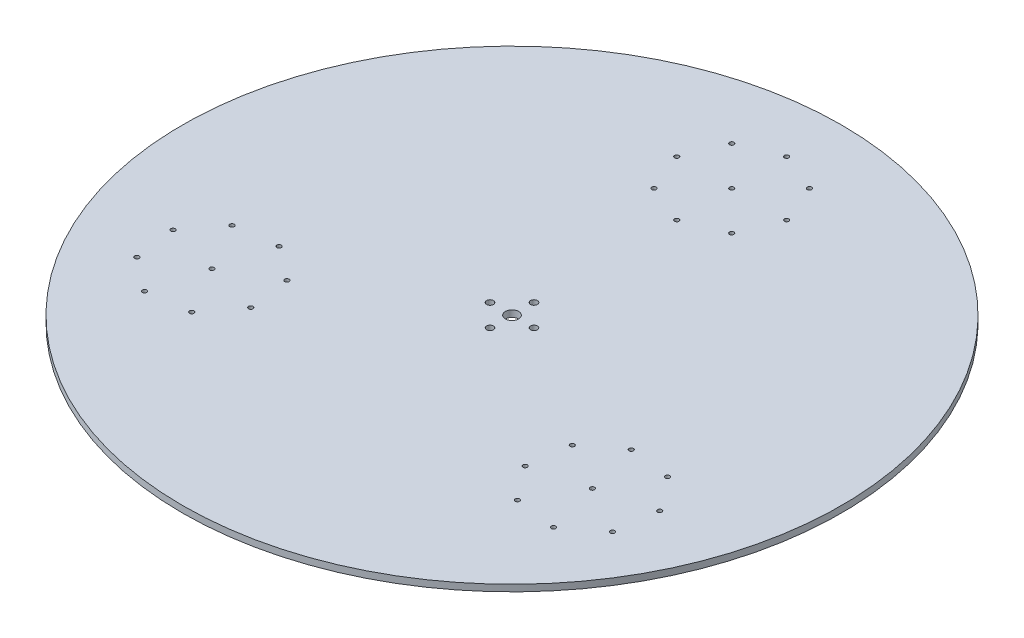
ISO-10303-21;
HEADER;
FILE_DESCRIPTION(('STEP AP214'),'2;1');
FILE_NAME('part.step','',(''),(''),'','','');
FILE_SCHEMA(('AUTOMOTIVE_DESIGN { 1 0 10303 214 1 1 1 1 }'));
ENDSEC;
DATA;
#1=APPLICATION_CONTEXT('core data for automotive mechanical design processes');
#2=APPLICATION_PROTOCOL_DEFINITION('international standard','automotive_design',2000,#1);
#3=PRODUCT_CONTEXT('',#1,'mechanical');
#4=PRODUCT('Part','Part','',(#3));
#5=PRODUCT_RELATED_PRODUCT_CATEGORY('part','',(#4));
#6=PRODUCT_DEFINITION_FORMATION('','',#4);
#7=PRODUCT_DEFINITION_CONTEXT('part definition',#1,'design');
#8=PRODUCT_DEFINITION('design','',#6,#7);
#9=PRODUCT_DEFINITION_SHAPE('','',#8);
#10=(LENGTH_UNIT() NAMED_UNIT(*) SI_UNIT(.MILLI.,.METRE.));
#11=(NAMED_UNIT(*) PLANE_ANGLE_UNIT() SI_UNIT($,.RADIAN.));
#12=(NAMED_UNIT(*) SI_UNIT($,.STERADIAN.) SOLID_ANGLE_UNIT());
#13=UNCERTAINTY_MEASURE_WITH_UNIT(LENGTH_MEASURE(1.E-05),#10,'distance_accuracy_value','');
#14=(GEOMETRIC_REPRESENTATION_CONTEXT(3) GLOBAL_UNCERTAINTY_ASSIGNED_CONTEXT((#13)) GLOBAL_UNIT_ASSIGNED_CONTEXT((#10,
#11,#12)) REPRESENTATION_CONTEXT('',''));
#15=CARTESIAN_POINT('',(0.,0.,0.));
#16=DIRECTION('',(0.,0.,1.));
#17=DIRECTION('',(1.,0.,0.));
#18=AXIS2_PLACEMENT_3D('',#15,#16,#17);
#19=CARTESIAN_POINT('',(0.,3.,0.));
#20=DIRECTION('',(0.,-1.,0.));
#21=DIRECTION('',(0.,0.,-1.));
#22=AXIS2_PLACEMENT_3D('',#19,#20,#21);
#23=CYLINDRICAL_SURFACE('',#22,3.);
#24=CARTESIAN_POINT('',(0.,3.,0.));
#25=DIRECTION('',(0.,1.,0.));
#26=DIRECTION('',(0.,0.,1.));
#27=AXIS2_PLACEMENT_3D('',#24,#25,#26);
#28=CIRCLE('',#27,3.);
#29=CARTESIAN_POINT('',(0.,3.,3.));
#30=VERTEX_POINT('',#29);
#31=EDGE_CURVE('E48',#30,#30,#28,.T.);
#32=ORIENTED_EDGE('',*,*,#31,.T.);
#33=EDGE_LOOP('',(#32));
#34=FACE_BOUND('',#33,.T.);
#35=CARTESIAN_POINT('',(0.,0.,0.));
#36=DIRECTION('',(0.,1.,0.));
#37=DIRECTION('',(0.,0.,1.));
#38=AXIS2_PLACEMENT_3D('',#35,#36,#37);
#39=CIRCLE('',#38,3.);
#40=CARTESIAN_POINT('',(0.,0.,3.));
#41=VERTEX_POINT('',#40);
#42=EDGE_CURVE('E181',#41,#41,#39,.T.);
#43=ORIENTED_EDGE('',*,*,#42,.F.);
#44=EDGE_LOOP('',(#43));
#45=FACE_BOUND('',#44,.T.);
#46=ADVANCED_FACE('F39',(#34,#45),#23,.F.);
#47=CARTESIAN_POINT('',(0.,3.,-10.));
#48=DIRECTION('',(0.,-1.,0.));
#49=DIRECTION('',(0.,0.,-1.));
#50=AXIS2_PLACEMENT_3D('',#47,#48,#49);
#51=CYLINDRICAL_SURFACE('',#50,1.55);
#52=CARTESIAN_POINT('',(0.,3.,-10.));
#53=DIRECTION('',(0.,1.,0.));
#54=DIRECTION('',(0.,0.,1.));
#55=AXIS2_PLACEMENT_3D('',#52,#53,#54);
#56=CIRCLE('',#55,1.55);
#57=CARTESIAN_POINT('',(0.,3.,-8.45));
#58=VERTEX_POINT('',#57);
#59=EDGE_CURVE('E54',#58,#58,#56,.T.);
#60=ORIENTED_EDGE('',*,*,#59,.T.);
#61=EDGE_LOOP('',(#60));
#62=FACE_BOUND('',#61,.T.);
#63=CARTESIAN_POINT('',(0.,0.,-10.));
#64=DIRECTION('',(0.,1.,0.));
#65=DIRECTION('',(0.,0.,1.));
#66=AXIS2_PLACEMENT_3D('',#63,#64,#65);
#67=CIRCLE('',#66,1.55);
#68=CARTESIAN_POINT('',(0.,0.,-8.45));
#69=VERTEX_POINT('',#68);
#70=EDGE_CURVE('E178',#69,#69,#67,.T.);
#71=ORIENTED_EDGE('',*,*,#70,.F.);
#72=EDGE_LOOP('',(#71));
#73=FACE_BOUND('',#72,.T.);
#74=ADVANCED_FACE('F316',(#62,#73),#51,.F.);
#75=CARTESIAN_POINT('',(10.0000000000001,3.,-1.12339726242554E-13));
#76=DIRECTION('',(0.,-1.,0.));
#77=DIRECTION('',(0.,0.,-1.));
#78=AXIS2_PLACEMENT_3D('',#75,#76,#77);
#79=CYLINDRICAL_SURFACE('',#78,1.55);
#80=CARTESIAN_POINT('',(10.0000000000001,3.,-1.12339726242554E-13));
#81=DIRECTION('',(0.,1.,0.));
#82=DIRECTION('',(0.,0.,1.));
#83=AXIS2_PLACEMENT_3D('',#80,#81,#82);
#84=CIRCLE('',#83,1.55);
#85=CARTESIAN_POINT('',(10.0000000000001,3.,1.54999999999989));
#86=VERTEX_POINT('',#85);
#87=EDGE_CURVE('E309',#86,#86,#84,.T.);
#88=ORIENTED_EDGE('',*,*,#87,.T.);
#89=EDGE_LOOP('',(#88));
#90=FACE_BOUND('',#89,.T.);
#91=CARTESIAN_POINT('',(10.0000000000001,0.,-1.12339726242554E-13));
#92=DIRECTION('',(0.,1.,0.));
#93=DIRECTION('',(0.,0.,1.));
#94=AXIS2_PLACEMENT_3D('',#91,#92,#93);
#95=CIRCLE('',#94,1.55);
#96=CARTESIAN_POINT('',(10.0000000000001,0.,1.54999999999989));
#97=VERTEX_POINT('',#96);
#98=EDGE_CURVE('E174',#97,#97,#95,.T.);
#99=ORIENTED_EDGE('',*,*,#98,.F.);
#100=EDGE_LOOP('',(#99));
#101=FACE_BOUND('',#100,.T.);
#102=ADVANCED_FACE('F334',(#90,#101),#79,.F.);
#103=CARTESIAN_POINT('',(2.24679452485108E-13,3.,10.));
#104=DIRECTION('',(0.,-1.,0.));
#105=DIRECTION('',(0.,0.,-1.));
#106=AXIS2_PLACEMENT_3D('',#103,#104,#105);
#107=CYLINDRICAL_SURFACE('',#106,1.55);
#108=CARTESIAN_POINT('',(2.24679452485108E-13,3.,10.));
#109=DIRECTION('',(0.,1.,0.));
#110=DIRECTION('',(0.,0.,1.));
#111=AXIS2_PLACEMENT_3D('',#108,#109,#110);
#112=CIRCLE('',#111,1.55);
#113=CARTESIAN_POINT('',(2.24679452485108E-13,3.,11.55));
#114=VERTEX_POINT('',#113);
#115=EDGE_CURVE('E305',#114,#114,#112,.T.);
#116=ORIENTED_EDGE('',*,*,#115,.T.);
#117=EDGE_LOOP('',(#116));
#118=FACE_BOUND('',#117,.T.);
#119=CARTESIAN_POINT('',(2.24679452485108E-13,0.,10.));
#120=DIRECTION('',(0.,1.,0.));
#121=DIRECTION('',(0.,0.,1.));
#122=AXIS2_PLACEMENT_3D('',#119,#120,#121);
#123=CIRCLE('',#122,1.55);
#124=CARTESIAN_POINT('',(2.24679452485108E-13,0.,11.55));
#125=VERTEX_POINT('',#124);
#126=EDGE_CURVE('E170',#125,#125,#123,.T.);
#127=ORIENTED_EDGE('',*,*,#126,.F.);
#128=EDGE_LOOP('',(#127));
#129=FACE_BOUND('',#128,.T.);
#130=ADVANCED_FACE('F341',(#118,#129),#107,.F.);
#131=CARTESIAN_POINT('',(-9.99999999999989,3.,1.13564373041701E-13));
#132=DIRECTION('',(0.,-1.,0.));
#133=DIRECTION('',(0.,0.,-1.));
#134=AXIS2_PLACEMENT_3D('',#131,#132,#133);
#135=CYLINDRICAL_SURFACE('',#134,1.55);
#136=CARTESIAN_POINT('',(-9.99999999999989,3.,1.13564373041701E-13));
#137=DIRECTION('',(0.,1.,0.));
#138=DIRECTION('',(0.,0.,1.));
#139=AXIS2_PLACEMENT_3D('',#136,#137,#138);
#140=CIRCLE('',#139,1.55);
#141=CARTESIAN_POINT('',(-9.99999999999989,3.,1.55000000000011));
#142=VERTEX_POINT('',#141);
#143=EDGE_CURVE('E301',#142,#142,#140,.T.);
#144=ORIENTED_EDGE('',*,*,#143,.T.);
#145=EDGE_LOOP('',(#144));
#146=FACE_BOUND('',#145,.T.);
#147=CARTESIAN_POINT('',(-9.99999999999989,0.,1.13564373041701E-13));
#148=DIRECTION('',(0.,1.,0.));
#149=DIRECTION('',(0.,0.,1.));
#150=AXIS2_PLACEMENT_3D('',#147,#148,#149);
#151=CIRCLE('',#150,1.55);
#152=CARTESIAN_POINT('',(-9.99999999999989,0.,1.55000000000011));
#153=VERTEX_POINT('',#152);
#154=EDGE_CURVE('E166',#153,#153,#151,.T.);
#155=ORIENTED_EDGE('',*,*,#154,.F.);
#156=EDGE_LOOP('',(#155));
#157=FACE_BOUND('',#156,.T.);
#158=ADVANCED_FACE('F345',(#146,#157),#135,.F.);
#159=CARTESIAN_POINT('',(0.,3.,-125.));
#160=DIRECTION('',(0.,-1.,0.));
#161=DIRECTION('',(0.,0.,-1.));
#162=AXIS2_PLACEMENT_3D('',#159,#160,#161);
#163=CYLINDRICAL_SURFACE('',#162,1.);
#164=CARTESIAN_POINT('',(0.,3.,-125.));
#165=DIRECTION('',(0.,1.,0.));
#166=DIRECTION('',(0.,0.,1.));
#167=AXIS2_PLACEMENT_3D('',#164,#165,#166);
#168=CIRCLE('',#167,1.);
#169=CARTESIAN_POINT('',(0.,3.,-124.));
#170=VERTEX_POINT('',#169);
#171=EDGE_CURVE('E297',#170,#170,#168,.T.);
#172=ORIENTED_EDGE('',*,*,#171,.T.);
#173=EDGE_LOOP('',(#172));
#174=FACE_BOUND('',#173,.T.);
#175=CARTESIAN_POINT('',(0.,0.,-125.));
#176=DIRECTION('',(0.,1.,0.));
#177=DIRECTION('',(0.,0.,1.));
#178=AXIS2_PLACEMENT_3D('',#175,#176,#177);
#179=CIRCLE('',#178,1.);
#180=CARTESIAN_POINT('',(0.,0.,-124.));
#181=VERTEX_POINT('',#180);
#182=EDGE_CURVE('E162',#181,#181,#179,.T.);
#183=ORIENTED_EDGE('',*,*,#182,.F.);
#184=EDGE_LOOP('',(#183));
#185=FACE_BOUND('',#184,.T.);
#186=ADVANCED_FACE('F349',(#174,#185),#163,.F.);
#187=CARTESIAN_POINT('',(17.6776695296639,3.,-117.677669529664));
#188=DIRECTION('',(0.,-1.,0.));
#189=DIRECTION('',(0.,0.,-1.));
#190=AXIS2_PLACEMENT_3D('',#187,#188,#189);
#191=CYLINDRICAL_SURFACE('',#190,1.00000000000001);
#192=CARTESIAN_POINT('',(17.6776695296639,3.,-117.677669529664));
#193=DIRECTION('',(0.,1.,0.));
#194=DIRECTION('',(0.,0.,1.));
#195=AXIS2_PLACEMENT_3D('',#192,#193,#194);
#196=CIRCLE('',#195,1.00000000000001);
#197=CARTESIAN_POINT('',(17.6776695296639,3.,-116.677669529664));
#198=VERTEX_POINT('',#197);
#199=EDGE_CURVE('E293',#198,#198,#196,.T.);
#200=ORIENTED_EDGE('',*,*,#199,.T.);
#201=EDGE_LOOP('',(#200));
#202=FACE_BOUND('',#201,.T.);
#203=CARTESIAN_POINT('',(17.6776695296639,0.,-117.677669529664));
#204=DIRECTION('',(0.,1.,0.));
#205=DIRECTION('',(0.,0.,1.));
#206=AXIS2_PLACEMENT_3D('',#203,#204,#205);
#207=CIRCLE('',#206,1.00000000000001);
#208=CARTESIAN_POINT('',(17.6776695296639,0.,-116.677669529664));
#209=VERTEX_POINT('',#208);
#210=EDGE_CURVE('E158',#209,#209,#207,.T.);
#211=ORIENTED_EDGE('',*,*,#210,.F.);
#212=EDGE_LOOP('',(#211));
#213=FACE_BOUND('',#212,.T.);
#214=ADVANCED_FACE('F353',(#202,#213),#191,.F.);
#215=CARTESIAN_POINT('',(25.0000000000007,3.,-100.000000000001));
#216=DIRECTION('',(0.,-1.,0.));
#217=DIRECTION('',(0.,0.,-1.));
#218=AXIS2_PLACEMENT_3D('',#215,#216,#217);
#219=CYLINDRICAL_SURFACE('',#218,1.00000000000001);
#220=CARTESIAN_POINT('',(25.0000000000007,3.,-100.000000000001));
#221=DIRECTION('',(0.,1.,0.));
#222=DIRECTION('',(0.,0.,1.));
#223=AXIS2_PLACEMENT_3D('',#220,#221,#222);
#224=CIRCLE('',#223,1.00000000000001);
#225=CARTESIAN_POINT('',(25.0000000000007,3.,-99.0000000000006));
#226=VERTEX_POINT('',#225);
#227=EDGE_CURVE('E289',#226,#226,#224,.T.);
#228=ORIENTED_EDGE('',*,*,#227,.T.);
#229=EDGE_LOOP('',(#228));
#230=FACE_BOUND('',#229,.T.);
#231=CARTESIAN_POINT('',(25.0000000000007,0.,-100.000000000001));
#232=DIRECTION('',(0.,1.,0.));
#233=DIRECTION('',(0.,0.,1.));
#234=AXIS2_PLACEMENT_3D('',#231,#232,#233);
#235=CIRCLE('',#234,1.00000000000001);
#236=CARTESIAN_POINT('',(25.0000000000007,0.,-99.0000000000006));
#237=VERTEX_POINT('',#236);
#238=EDGE_CURVE('E154',#237,#237,#235,.T.);
#239=ORIENTED_EDGE('',*,*,#238,.F.);
#240=EDGE_LOOP('',(#239));
#241=FACE_BOUND('',#240,.T.);
#242=ADVANCED_FACE('F357',(#230,#241),#219,.F.);
#243=CARTESIAN_POINT('',(17.6776695296648,3.,-82.3223304703367));
#244=DIRECTION('',(0.,-1.,0.));
#245=DIRECTION('',(0.,0.,-1.));
#246=AXIS2_PLACEMENT_3D('',#243,#244,#245);
#247=CYLINDRICAL_SURFACE('',#246,1.00000000000001);
#248=CARTESIAN_POINT('',(17.6776695296648,3.,-82.3223304703367));
#249=DIRECTION('',(0.,1.,0.));
#250=DIRECTION('',(0.,0.,1.));
#251=AXIS2_PLACEMENT_3D('',#248,#249,#250);
#252=CIRCLE('',#251,1.00000000000001);
#253=CARTESIAN_POINT('',(17.6776695296648,3.,-81.3223304703367));
#254=VERTEX_POINT('',#253);
#255=EDGE_CURVE('E285',#254,#254,#252,.T.);
#256=ORIENTED_EDGE('',*,*,#255,.T.);
#257=EDGE_LOOP('',(#256));
#258=FACE_BOUND('',#257,.T.);
#259=CARTESIAN_POINT('',(17.6776695296648,0.,-82.3223304703367));
#260=DIRECTION('',(0.,1.,0.));
#261=DIRECTION('',(0.,0.,1.));
#262=AXIS2_PLACEMENT_3D('',#259,#260,#261);
#263=CIRCLE('',#262,1.00000000000001);
#264=CARTESIAN_POINT('',(17.6776695296648,0.,-81.3223304703367));
#265=VERTEX_POINT('',#264);
#266=EDGE_CURVE('E150',#265,#265,#263,.T.);
#267=ORIENTED_EDGE('',*,*,#266,.F.);
#268=EDGE_LOOP('',(#267));
#269=FACE_BOUND('',#268,.T.);
#270=ADVANCED_FACE('F361',(#258,#269),#247,.F.);
#271=CARTESIAN_POINT('',(1.23426493658657E-12,3.,-75.));
#272=DIRECTION('',(0.,-1.,0.));
#273=DIRECTION('',(0.,0.,-1.));
#274=AXIS2_PLACEMENT_3D('',#271,#272,#273);
#275=CYLINDRICAL_SURFACE('',#274,1.);
#276=CARTESIAN_POINT('',(1.23426493658657E-12,3.,-75.));
#277=DIRECTION('',(0.,1.,0.));
#278=DIRECTION('',(0.,0.,1.));
#279=AXIS2_PLACEMENT_3D('',#276,#277,#278);
#280=CIRCLE('',#279,1.);
#281=CARTESIAN_POINT('',(1.23426493658657E-12,3.,-74.));
#282=VERTEX_POINT('',#281);
#283=EDGE_CURVE('E281',#282,#282,#280,.T.);
#284=ORIENTED_EDGE('',*,*,#283,.T.);
#285=EDGE_LOOP('',(#284));
#286=FACE_BOUND('',#285,.T.);
#287=CARTESIAN_POINT('',(1.23426493658657E-12,0.,-75.));
#288=DIRECTION('',(0.,1.,0.));
#289=DIRECTION('',(0.,0.,1.));
#290=AXIS2_PLACEMENT_3D('',#287,#288,#289);
#291=CIRCLE('',#290,1.);
#292=CARTESIAN_POINT('',(1.23426493658657E-12,0.,-74.));
#293=VERTEX_POINT('',#292);
#294=EDGE_CURVE('E146',#293,#293,#291,.T.);
#295=ORIENTED_EDGE('',*,*,#294,.F.);
#296=EDGE_LOOP('',(#295));
#297=FACE_BOUND('',#296,.T.);
#298=ADVANCED_FACE('F365',(#286,#297),#275,.F.);
#299=CARTESIAN_POINT('',(-17.6776695296626,3.,-82.322330470336));
#300=DIRECTION('',(0.,-1.,0.));
#301=DIRECTION('',(0.,0.,-1.));
#302=AXIS2_PLACEMENT_3D('',#299,#300,#301);
#303=CYLINDRICAL_SURFACE('',#302,1.);
#304=CARTESIAN_POINT('',(-17.6776695296626,3.,-82.322330470336));
#305=DIRECTION('',(0.,1.,0.));
#306=DIRECTION('',(0.,0.,1.));
#307=AXIS2_PLACEMENT_3D('',#304,#305,#306);
#308=CIRCLE('',#307,1.);
#309=CARTESIAN_POINT('',(-17.6776695296626,3.,-81.322330470336));
#310=VERTEX_POINT('',#309);
#311=EDGE_CURVE('E277',#310,#310,#308,.T.);
#312=ORIENTED_EDGE('',*,*,#311,.T.);
#313=EDGE_LOOP('',(#312));
#314=FACE_BOUND('',#313,.T.);
#315=CARTESIAN_POINT('',(-17.6776695296626,0.,-82.322330470336));
#316=DIRECTION('',(0.,1.,0.));
#317=DIRECTION('',(0.,0.,1.));
#318=AXIS2_PLACEMENT_3D('',#315,#316,#317);
#319=CIRCLE('',#318,1.);
#320=CARTESIAN_POINT('',(-17.6776695296626,0.,-81.322330470336));
#321=VERTEX_POINT('',#320);
#322=EDGE_CURVE('E142',#321,#321,#319,.T.);
#323=ORIENTED_EDGE('',*,*,#322,.F.);
#324=EDGE_LOOP('',(#323));
#325=FACE_BOUND('',#324,.T.);
#326=ADVANCED_FACE('F369',(#314,#325),#303,.F.);
#327=CARTESIAN_POINT('',(-24.9999999999993,3.,-99.9999999999996));
#328=DIRECTION('',(0.,-1.,0.));
#329=DIRECTION('',(0.,0.,-1.));
#330=AXIS2_PLACEMENT_3D('',#327,#328,#329);
#331=CYLINDRICAL_SURFACE('',#330,1.00000000000001);
#332=CARTESIAN_POINT('',(-24.9999999999993,3.,-99.9999999999996));
#333=DIRECTION('',(0.,1.,0.));
#334=DIRECTION('',(0.,0.,1.));
#335=AXIS2_PLACEMENT_3D('',#332,#333,#334);
#336=CIRCLE('',#335,1.00000000000001);
#337=CARTESIAN_POINT('',(-24.9999999999993,3.,-98.9999999999995));
#338=VERTEX_POINT('',#337);
#339=EDGE_CURVE('E273',#338,#338,#336,.T.);
#340=ORIENTED_EDGE('',*,*,#339,.T.);
#341=EDGE_LOOP('',(#340));
#342=FACE_BOUND('',#341,.T.);
#343=CARTESIAN_POINT('',(-24.9999999999993,0.,-99.9999999999996));
#344=DIRECTION('',(0.,1.,0.));
#345=DIRECTION('',(0.,0.,1.));
#346=AXIS2_PLACEMENT_3D('',#343,#344,#345);
#347=CIRCLE('',#346,1.00000000000001);
#348=CARTESIAN_POINT('',(-24.9999999999993,0.,-98.9999999999995));
#349=VERTEX_POINT('',#348);
#350=EDGE_CURVE('E138',#349,#349,#347,.T.);
#351=ORIENTED_EDGE('',*,*,#350,.F.);
#352=EDGE_LOOP('',(#351));
#353=FACE_BOUND('',#352,.T.);
#354=ADVANCED_FACE('F373',(#342,#353),#331,.F.);
#355=CARTESIAN_POINT('',(-17.6776695296633,3.,-117.677669529663));
#356=DIRECTION('',(0.,-1.,0.));
#357=DIRECTION('',(0.,0.,-1.));
#358=AXIS2_PLACEMENT_3D('',#355,#356,#357);
#359=CYLINDRICAL_SURFACE('',#358,1.);
#360=CARTESIAN_POINT('',(-17.6776695296633,3.,-117.677669529663));
#361=DIRECTION('',(0.,1.,0.));
#362=DIRECTION('',(0.,0.,1.));
#363=AXIS2_PLACEMENT_3D('',#360,#361,#362);
#364=CIRCLE('',#363,1.);
#365=CARTESIAN_POINT('',(-17.6776695296633,3.,-116.677669529663));
#366=VERTEX_POINT('',#365);
#367=EDGE_CURVE('E269',#366,#366,#364,.T.);
#368=ORIENTED_EDGE('',*,*,#367,.T.);
#369=EDGE_LOOP('',(#368));
#370=FACE_BOUND('',#369,.T.);
#371=CARTESIAN_POINT('',(-17.6776695296633,0.,-117.677669529663));
#372=DIRECTION('',(0.,1.,0.));
#373=DIRECTION('',(0.,0.,1.));
#374=AXIS2_PLACEMENT_3D('',#371,#372,#373);
#375=CIRCLE('',#374,1.);
#376=CARTESIAN_POINT('',(-17.6776695296633,0.,-116.677669529663));
#377=VERTEX_POINT('',#376);
#378=EDGE_CURVE('E134',#377,#377,#375,.T.);
#379=ORIENTED_EDGE('',*,*,#378,.F.);
#380=EDGE_LOOP('',(#379));
#381=FACE_BOUND('',#380,.T.);
#382=ADVANCED_FACE('F377',(#370,#381),#359,.F.);
#383=CARTESIAN_POINT('',(0.,3.,-100.));
#384=DIRECTION('',(0.,-1.,0.));
#385=DIRECTION('',(0.,0.,-1.));
#386=AXIS2_PLACEMENT_3D('',#383,#384,#385);
#387=CYLINDRICAL_SURFACE('',#386,1.);
#388=CARTESIAN_POINT('',(0.,3.,-100.));
#389=DIRECTION('',(0.,1.,0.));
#390=DIRECTION('',(0.,0.,1.));
#391=AXIS2_PLACEMENT_3D('',#388,#389,#390);
#392=CIRCLE('',#391,1.);
#393=CARTESIAN_POINT('',(0.,3.,-99.));
#394=VERTEX_POINT('',#393);
#395=EDGE_CURVE('E265',#394,#394,#392,.T.);
#396=ORIENTED_EDGE('',*,*,#395,.T.);
#397=EDGE_LOOP('',(#396));
#398=FACE_BOUND('',#397,.T.);
#399=CARTESIAN_POINT('',(0.,0.,-100.));
#400=DIRECTION('',(0.,1.,0.));
#401=DIRECTION('',(0.,0.,1.));
#402=AXIS2_PLACEMENT_3D('',#399,#400,#401);
#403=CIRCLE('',#402,1.);
#404=CARTESIAN_POINT('',(0.,0.,-99.));
#405=VERTEX_POINT('',#404);
#406=EDGE_CURVE('E130',#405,#405,#403,.T.);
#407=ORIENTED_EDGE('',*,*,#406,.F.);
#408=EDGE_LOOP('',(#407));
#409=FACE_BOUND('',#408,.T.);
#410=ADVANCED_FACE('F381',(#398,#409),#387,.F.);
#411=CARTESIAN_POINT('',(110.75068603567,3.,43.5295238724377));
#412=DIRECTION('',(0.,-1.,0.));
#413=DIRECTION('',(0.,0.,-1.));
#414=AXIS2_PLACEMENT_3D('',#411,#412,#413);
#415=CYLINDRICAL_SURFACE('',#414,1.);
#416=CARTESIAN_POINT('',(110.75068603567,3.,43.5295238724377));
#417=DIRECTION('',(0.,1.,0.));
#418=DIRECTION('',(0.,0.,1.));
#419=AXIS2_PLACEMENT_3D('',#416,#417,#418);
#420=CIRCLE('',#419,1.);
#421=CARTESIAN_POINT('',(110.75068603567,3.,44.5295238724377));
#422=VERTEX_POINT('',#421);
#423=EDGE_CURVE('E261',#422,#422,#420,.T.);
#424=ORIENTED_EDGE('',*,*,#423,.T.);
#425=EDGE_LOOP('',(#424));
#426=FACE_BOUND('',#425,.T.);
#427=CARTESIAN_POINT('',(110.75068603567,0.,43.5295238724377));
#428=DIRECTION('',(0.,1.,0.));
#429=DIRECTION('',(0.,0.,1.));
#430=AXIS2_PLACEMENT_3D('',#427,#428,#429);
#431=CIRCLE('',#430,1.);
#432=CARTESIAN_POINT('',(110.75068603567,0.,44.5295238724377));
#433=VERTEX_POINT('',#432);
#434=EDGE_CURVE('E126',#433,#433,#431,.T.);
#435=ORIENTED_EDGE('',*,*,#434,.F.);
#436=EDGE_LOOP('',(#435));
#437=FACE_BOUND('',#436,.T.);
#438=ADVANCED_FACE('F385',(#426,#437),#415,.F.);
#439=CARTESIAN_POINT('',(108.253175473055,3.,62.5000000000005));
#440=DIRECTION('',(0.,-1.,0.));
#441=DIRECTION('',(0.,0.,-1.));
#442=AXIS2_PLACEMENT_3D('',#439,#440,#441);
#443=CYLINDRICAL_SURFACE('',#442,0.999999999999999);
#444=CARTESIAN_POINT('',(108.253175473055,3.,62.5000000000005));
#445=DIRECTION('',(0.,1.,0.));
#446=DIRECTION('',(0.,0.,1.));
#447=AXIS2_PLACEMENT_3D('',#444,#445,#446);
#448=CIRCLE('',#447,0.999999999999999);
#449=CARTESIAN_POINT('',(108.253175473055,3.,63.5000000000005));
#450=VERTEX_POINT('',#449);
#451=EDGE_CURVE('E257',#450,#450,#448,.T.);
#452=ORIENTED_EDGE('',*,*,#451,.T.);
#453=EDGE_LOOP('',(#452));
#454=FACE_BOUND('',#453,.T.);
#455=CARTESIAN_POINT('',(108.253175473055,0.,62.5000000000005));
#456=DIRECTION('',(0.,1.,0.));
#457=DIRECTION('',(0.,0.,1.));
#458=AXIS2_PLACEMENT_3D('',#455,#456,#457);
#459=CIRCLE('',#458,0.999999999999999);
#460=CARTESIAN_POINT('',(108.253175473055,0.,63.5000000000005));
#461=VERTEX_POINT('',#460);
#462=EDGE_CURVE('E122',#461,#461,#459,.T.);
#463=ORIENTED_EDGE('',*,*,#462,.F.);
#464=EDGE_LOOP('',(#463));
#465=FACE_BOUND('',#464,.T.);
#466=ADVANCED_FACE('F389',(#454,#465),#443,.F.);
#467=CARTESIAN_POINT('',(93.0730165060069,3.,74.1481456572276));
#468=DIRECTION('',(0.,-1.,0.));
#469=DIRECTION('',(0.,0.,-1.));
#470=AXIS2_PLACEMENT_3D('',#467,#468,#469);
#471=CYLINDRICAL_SURFACE('',#470,1.00000000000001);
#472=CARTESIAN_POINT('',(93.0730165060069,3.,74.1481456572276));
#473=DIRECTION('',(0.,1.,0.));
#474=DIRECTION('',(0.,0.,1.));
#475=AXIS2_PLACEMENT_3D('',#472,#473,#474);
#476=CIRCLE('',#475,1.00000000000001);
#477=CARTESIAN_POINT('',(93.0730165060069,3.,75.1481456572276));
#478=VERTEX_POINT('',#477);
#479=EDGE_CURVE('E253',#478,#478,#476,.T.);
#480=ORIENTED_EDGE('',*,*,#479,.T.);
#481=EDGE_LOOP('',(#480));
#482=FACE_BOUND('',#481,.T.);
#483=CARTESIAN_POINT('',(93.0730165060069,0.,74.1481456572276));
#484=DIRECTION('',(0.,1.,0.));
#485=DIRECTION('',(0.,0.,1.));
#486=AXIS2_PLACEMENT_3D('',#483,#484,#485);
#487=CIRCLE('',#486,1.00000000000001);
#488=CARTESIAN_POINT('',(93.0730165060069,0.,75.1481456572276));
#489=VERTEX_POINT('',#488);
#490=EDGE_CURVE('E118',#489,#489,#487,.T.);
#491=ORIENTED_EDGE('',*,*,#490,.F.);
#492=EDGE_LOOP('',(#491));
#493=FACE_BOUND('',#492,.T.);
#494=ADVANCED_FACE('F393',(#482,#493),#471,.F.);
#495=CARTESIAN_POINT('',(99.102540378443,3.,28.3493649053899));
#496=DIRECTION('',(0.,-1.,0.));
#497=DIRECTION('',(0.,0.,-1.));
#498=AXIS2_PLACEMENT_3D('',#495,#496,#497);
#499=CYLINDRICAL_SURFACE('',#498,1.00000000000002);
#500=CARTESIAN_POINT('',(99.102540378443,3.,28.3493649053899));
#501=DIRECTION('',(0.,1.,0.));
#502=DIRECTION('',(0.,0.,1.));
#503=AXIS2_PLACEMENT_3D('',#500,#501,#502);
#504=CIRCLE('',#503,1.00000000000002);
#505=CARTESIAN_POINT('',(99.102540378443,3.,29.3493649053899));
#506=VERTEX_POINT('',#505);
#507=EDGE_CURVE('E249',#506,#506,#504,.T.);
#508=ORIENTED_EDGE('',*,*,#507,.T.);
#509=EDGE_LOOP('',(#508));
#510=FACE_BOUND('',#509,.T.);
#511=CARTESIAN_POINT('',(99.102540378443,0.,28.3493649053899));
#512=DIRECTION('',(0.,1.,0.));
#513=DIRECTION('',(0.,0.,1.));
#514=AXIS2_PLACEMENT_3D('',#511,#512,#513);
#515=CIRCLE('',#514,1.00000000000002);
#516=CARTESIAN_POINT('',(99.102540378443,0.,29.3493649053899));
#517=VERTEX_POINT('',#516);
#518=EDGE_CURVE('E114',#517,#517,#515,.T.);
#519=ORIENTED_EDGE('',*,*,#518,.F.);
#520=EDGE_LOOP('',(#519));
#521=FACE_BOUND('',#520,.T.);
#522=ADVANCED_FACE('F397',(#510,#521),#499,.F.);
#523=CARTESIAN_POINT('',(86.6025403784437,3.,50.0000000000004));
#524=DIRECTION('',(0.,-1.,0.));
#525=DIRECTION('',(0.,0.,-1.));
#526=AXIS2_PLACEMENT_3D('',#523,#524,#525);
#527=CYLINDRICAL_SURFACE('',#526,0.999999999999999);
#528=CARTESIAN_POINT('',(86.6025403784437,3.,50.0000000000004));
#529=DIRECTION('',(0.,1.,0.));
#530=DIRECTION('',(0.,0.,1.));
#531=AXIS2_PLACEMENT_3D('',#528,#529,#530);
#532=CIRCLE('',#531,0.999999999999999);
#533=CARTESIAN_POINT('',(86.6025403784437,3.,51.0000000000004));
#534=VERTEX_POINT('',#533);
#535=EDGE_CURVE('E245',#534,#534,#532,.T.);
#536=ORIENTED_EDGE('',*,*,#535,.T.);
#537=EDGE_LOOP('',(#536));
#538=FACE_BOUND('',#537,.T.);
#539=CARTESIAN_POINT('',(86.6025403784437,0.,50.0000000000004));
#540=DIRECTION('',(0.,1.,0.));
#541=DIRECTION('',(0.,0.,1.));
#542=AXIS2_PLACEMENT_3D('',#539,#540,#541);
#543=CIRCLE('',#542,0.999999999999999);
#544=CARTESIAN_POINT('',(86.6025403784437,0.,51.0000000000004));
#545=VERTEX_POINT('',#544);
#546=EDGE_CURVE('E110',#545,#545,#543,.T.);
#547=ORIENTED_EDGE('',*,*,#546,.F.);
#548=EDGE_LOOP('',(#547));
#549=FACE_BOUND('',#548,.T.);
#550=ADVANCED_FACE('F401',(#538,#549),#527,.F.);
#551=CARTESIAN_POINT('',(80.1320642508799,3.,25.8518543427744));
#552=DIRECTION('',(0.,-1.,0.));
#553=DIRECTION('',(0.,0.,-1.));
#554=AXIS2_PLACEMENT_3D('',#551,#552,#553);
#555=CYLINDRICAL_SURFACE('',#554,1.00000000000001);
#556=CARTESIAN_POINT('',(80.1320642508799,3.,25.8518543427744));
#557=DIRECTION('',(0.,1.,0.));
#558=DIRECTION('',(0.,0.,1.));
#559=AXIS2_PLACEMENT_3D('',#556,#557,#558);
#560=CIRCLE('',#559,1.00000000000001);
#561=CARTESIAN_POINT('',(80.1320642508799,3.,26.8518543427744));
#562=VERTEX_POINT('',#561);
#563=EDGE_CURVE('E241',#562,#562,#560,.T.);
#564=ORIENTED_EDGE('',*,*,#563,.T.);
#565=EDGE_LOOP('',(#564));
#566=FACE_BOUND('',#565,.T.);
#567=CARTESIAN_POINT('',(80.1320642508799,0.,25.8518543427744));
#568=DIRECTION('',(0.,1.,0.));
#569=DIRECTION('',(0.,0.,1.));
#570=AXIS2_PLACEMENT_3D('',#567,#568,#569);
#571=CIRCLE('',#570,1.00000000000001);
#572=CARTESIAN_POINT('',(80.1320642508799,0.,26.8518543427744));
#573=VERTEX_POINT('',#572);
#574=EDGE_CURVE('E106',#573,#573,#571,.T.);
#575=ORIENTED_EDGE('',*,*,#574,.F.);
#576=EDGE_LOOP('',(#575));
#577=FACE_BOUND('',#576,.T.);
#578=ADVANCED_FACE('F405',(#566,#577),#555,.F.);
#579=CARTESIAN_POINT('',(64.9519052838322,3.,37.5000000000014));
#580=DIRECTION('',(0.,-1.,0.));
#581=DIRECTION('',(0.,0.,-1.));
#582=AXIS2_PLACEMENT_3D('',#579,#580,#581);
#583=CYLINDRICAL_SURFACE('',#582,0.999999999999999);
#584=CARTESIAN_POINT('',(64.9519052838322,3.,37.5000000000014));
#585=DIRECTION('',(0.,1.,0.));
#586=DIRECTION('',(0.,0.,1.));
#587=AXIS2_PLACEMENT_3D('',#584,#585,#586);
#588=CIRCLE('',#587,0.999999999999999);
#589=CARTESIAN_POINT('',(64.9519052838322,3.,38.5000000000014));
#590=VERTEX_POINT('',#589);
#591=EDGE_CURVE('E237',#590,#590,#588,.T.);
#592=ORIENTED_EDGE('',*,*,#591,.T.);
#593=EDGE_LOOP('',(#592));
#594=FACE_BOUND('',#593,.T.);
#595=CARTESIAN_POINT('',(64.9519052838322,0.,37.5000000000014));
#596=DIRECTION('',(0.,1.,0.));
#597=DIRECTION('',(0.,0.,1.));
#598=AXIS2_PLACEMENT_3D('',#595,#596,#597);
#599=CIRCLE('',#598,0.999999999999999);
#600=CARTESIAN_POINT('',(64.9519052838322,0.,38.5000000000014));
#601=VERTEX_POINT('',#600);
#602=EDGE_CURVE('E102',#601,#601,#599,.T.);
#603=ORIENTED_EDGE('',*,*,#602,.F.);
#604=EDGE_LOOP('',(#603));
#605=FACE_BOUND('',#604,.T.);
#606=ADVANCED_FACE('F409',(#594,#605),#583,.F.);
#607=CARTESIAN_POINT('',(62.4543947212168,3.,56.4704761275645));
#608=DIRECTION('',(0.,-1.,0.));
#609=DIRECTION('',(0.,0.,-1.));
#610=AXIS2_PLACEMENT_3D('',#607,#608,#609);
#611=CYLINDRICAL_SURFACE('',#610,1.00000000000002);
#612=CARTESIAN_POINT('',(62.4543947212168,3.,56.4704761275645));
#613=DIRECTION('',(0.,1.,0.));
#614=DIRECTION('',(0.,0.,1.));
#615=AXIS2_PLACEMENT_3D('',#612,#613,#614);
#616=CIRCLE('',#615,1.00000000000002);
#617=CARTESIAN_POINT('',(62.4543947212168,3.,57.4704761275645));
#618=VERTEX_POINT('',#617);
#619=EDGE_CURVE('E233',#618,#618,#616,.T.);
#620=ORIENTED_EDGE('',*,*,#619,.T.);
#621=EDGE_LOOP('',(#620));
#622=FACE_BOUND('',#621,.T.);
#623=CARTESIAN_POINT('',(62.4543947212168,0.,56.4704761275645));
#624=DIRECTION('',(0.,1.,0.));
#625=DIRECTION('',(0.,0.,1.));
#626=AXIS2_PLACEMENT_3D('',#623,#624,#625);
#627=CIRCLE('',#626,1.00000000000002);
#628=CARTESIAN_POINT('',(62.4543947212168,0.,57.4704761275645));
#629=VERTEX_POINT('',#628);
#630=EDGE_CURVE('E98',#629,#629,#627,.T.);
#631=ORIENTED_EDGE('',*,*,#630,.F.);
#632=EDGE_LOOP('',(#631));
#633=FACE_BOUND('',#632,.T.);
#634=ADVANCED_FACE('F413',(#622,#633),#611,.F.);
#635=CARTESIAN_POINT('',(74.1025403784438,3.,71.6506350946122));
#636=DIRECTION('',(0.,-1.,0.));
#637=DIRECTION('',(0.,0.,-1.));
#638=AXIS2_PLACEMENT_3D('',#635,#636,#637);
#639=CYLINDRICAL_SURFACE('',#638,1.00000000000001);
#640=CARTESIAN_POINT('',(74.1025403784438,3.,71.6506350946122));
#641=DIRECTION('',(0.,1.,0.));
#642=DIRECTION('',(0.,0.,1.));
#643=AXIS2_PLACEMENT_3D('',#640,#641,#642);
#644=CIRCLE('',#643,1.00000000000001);
#645=CARTESIAN_POINT('',(74.1025403784438,3.,72.6506350946123));
#646=VERTEX_POINT('',#645);
#647=EDGE_CURVE('E229',#646,#646,#644,.T.);
#648=ORIENTED_EDGE('',*,*,#647,.T.);
#649=EDGE_LOOP('',(#648));
#650=FACE_BOUND('',#649,.T.);
#651=CARTESIAN_POINT('',(74.1025403784438,0.,71.6506350946122));
#652=DIRECTION('',(0.,1.,0.));
#653=DIRECTION('',(0.,0.,1.));
#654=AXIS2_PLACEMENT_3D('',#651,#652,#653);
#655=CIRCLE('',#654,1.00000000000001);
#656=CARTESIAN_POINT('',(74.1025403784438,0.,72.6506350946123));
#657=VERTEX_POINT('',#656);
#658=EDGE_CURVE('E94',#657,#657,#655,.T.);
#659=ORIENTED_EDGE('',*,*,#658,.F.);
#660=EDGE_LOOP('',(#659));
#661=FACE_BOUND('',#660,.T.);
#662=ADVANCED_FACE('F417',(#650,#661),#639,.F.);
#663=CARTESIAN_POINT('',(-93.0730165060075,3.,74.1481456572253));
#664=DIRECTION('',(0.,-1.,0.));
#665=DIRECTION('',(0.,0.,-1.));
#666=AXIS2_PLACEMENT_3D('',#663,#664,#665);
#667=CYLINDRICAL_SURFACE('',#666,0.999999999999999);
#668=CARTESIAN_POINT('',(-93.0730165060075,3.,74.1481456572253));
#669=DIRECTION('',(0.,1.,0.));
#670=DIRECTION('',(0.,0.,1.));
#671=AXIS2_PLACEMENT_3D('',#668,#669,#670);
#672=CIRCLE('',#671,0.999999999999999);
#673=CARTESIAN_POINT('',(-93.0730165060075,3.,75.1481456572253));
#674=VERTEX_POINT('',#673);
#675=EDGE_CURVE('E225',#674,#674,#672,.T.);
#676=ORIENTED_EDGE('',*,*,#675,.T.);
#677=EDGE_LOOP('',(#676));
#678=FACE_BOUND('',#677,.T.);
#679=CARTESIAN_POINT('',(-93.0730165060075,0.,74.1481456572253));
#680=DIRECTION('',(0.,1.,0.));
#681=DIRECTION('',(0.,0.,1.));
#682=AXIS2_PLACEMENT_3D('',#679,#680,#681);
#683=CIRCLE('',#682,0.999999999999999);
#684=CARTESIAN_POINT('',(-93.0730165060075,0.,75.1481456572253));
#685=VERTEX_POINT('',#684);
#686=EDGE_CURVE('E90',#685,#685,#683,.T.);
#687=ORIENTED_EDGE('',*,*,#686,.F.);
#688=EDGE_LOOP('',(#687));
#689=FACE_BOUND('',#688,.T.);
#690=ADVANCED_FACE('F421',(#678,#689),#667,.F.);
#691=CARTESIAN_POINT('',(-108.253175473055,3.,62.499999999999));
#692=DIRECTION('',(0.,-1.,0.));
#693=DIRECTION('',(0.,0.,-1.));
#694=AXIS2_PLACEMENT_3D('',#691,#692,#693);
#695=CYLINDRICAL_SURFACE('',#694,1.00000000000001);
#696=CARTESIAN_POINT('',(-108.253175473055,3.,62.499999999999));
#697=DIRECTION('',(0.,1.,0.));
#698=DIRECTION('',(0.,0.,1.));
#699=AXIS2_PLACEMENT_3D('',#696,#697,#698);
#700=CIRCLE('',#699,1.00000000000001);
#701=CARTESIAN_POINT('',(-108.253175473055,3.,63.499999999999));
#702=VERTEX_POINT('',#701);
#703=EDGE_CURVE('E221',#702,#702,#700,.T.);
#704=ORIENTED_EDGE('',*,*,#703,.T.);
#705=EDGE_LOOP('',(#704));
#706=FACE_BOUND('',#705,.T.);
#707=CARTESIAN_POINT('',(-108.253175473055,0.,62.499999999999));
#708=DIRECTION('',(0.,1.,0.));
#709=DIRECTION('',(0.,0.,1.));
#710=AXIS2_PLACEMENT_3D('',#707,#708,#709);
#711=CIRCLE('',#710,1.00000000000001);
#712=CARTESIAN_POINT('',(-108.253175473055,0.,63.499999999999));
#713=VERTEX_POINT('',#712);
#714=EDGE_CURVE('E86',#713,#713,#711,.T.);
#715=ORIENTED_EDGE('',*,*,#714,.F.);
#716=EDGE_LOOP('',(#715));
#717=FACE_BOUND('',#716,.T.);
#718=ADVANCED_FACE('F425',(#706,#717),#695,.F.);
#719=CARTESIAN_POINT('',(-110.750686035671,3.,43.529523872436));
#720=DIRECTION('',(0.,-1.,0.));
#721=DIRECTION('',(0.,0.,-1.));
#722=AXIS2_PLACEMENT_3D('',#719,#720,#721);
#723=CYLINDRICAL_SURFACE('',#722,0.999999999999999);
#724=CARTESIAN_POINT('',(-110.750686035671,3.,43.529523872436));
#725=DIRECTION('',(0.,1.,0.));
#726=DIRECTION('',(0.,0.,1.));
#727=AXIS2_PLACEMENT_3D('',#724,#725,#726);
#728=CIRCLE('',#727,0.999999999999999);
#729=CARTESIAN_POINT('',(-110.750686035671,3.,44.529523872436));
#730=VERTEX_POINT('',#729);
#731=EDGE_CURVE('E217',#730,#730,#728,.T.);
#732=ORIENTED_EDGE('',*,*,#731,.T.);
#733=EDGE_LOOP('',(#732));
#734=FACE_BOUND('',#733,.T.);
#735=CARTESIAN_POINT('',(-110.750686035671,0.,43.529523872436));
#736=DIRECTION('',(0.,1.,0.));
#737=DIRECTION('',(0.,0.,1.));
#738=AXIS2_PLACEMENT_3D('',#735,#736,#737);
#739=CIRCLE('',#738,0.999999999999999);
#740=CARTESIAN_POINT('',(-110.750686035671,0.,44.529523872436));
#741=VERTEX_POINT('',#740);
#742=EDGE_CURVE('E82',#741,#741,#739,.T.);
#743=ORIENTED_EDGE('',*,*,#742,.F.);
#744=EDGE_LOOP('',(#743));
#745=FACE_BOUND('',#744,.T.);
#746=ADVANCED_FACE('F429',(#734,#745),#723,.F.);
#747=CARTESIAN_POINT('',(-74.1025403784445,3.,71.6506350946094));
#748=DIRECTION('',(0.,-1.,0.));
#749=DIRECTION('',(0.,0.,-1.));
#750=AXIS2_PLACEMENT_3D('',#747,#748,#749);
#751=CYLINDRICAL_SURFACE('',#750,1.00000000000002);
#752=CARTESIAN_POINT('',(-74.1025403784445,3.,71.6506350946094));
#753=DIRECTION('',(0.,1.,0.));
#754=DIRECTION('',(0.,0.,1.));
#755=AXIS2_PLACEMENT_3D('',#752,#753,#754);
#756=CIRCLE('',#755,1.00000000000002);
#757=CARTESIAN_POINT('',(-74.1025403784445,3.,72.6506350946095));
#758=VERTEX_POINT('',#757);
#759=EDGE_CURVE('E213',#758,#758,#756,.T.);
#760=ORIENTED_EDGE('',*,*,#759,.T.);
#761=EDGE_LOOP('',(#760));
#762=FACE_BOUND('',#761,.T.);
#763=CARTESIAN_POINT('',(-74.1025403784445,0.,71.6506350946094));
#764=DIRECTION('',(0.,1.,0.));
#765=DIRECTION('',(0.,0.,1.));
#766=AXIS2_PLACEMENT_3D('',#763,#764,#765);
#767=CIRCLE('',#766,1.00000000000002);
#768=CARTESIAN_POINT('',(-74.1025403784445,0.,72.6506350946095));
#769=VERTEX_POINT('',#768);
#770=EDGE_CURVE('E78',#769,#769,#767,.T.);
#771=ORIENTED_EDGE('',*,*,#770,.F.);
#772=EDGE_LOOP('',(#771));
#773=FACE_BOUND('',#772,.T.);
#774=ADVANCED_FACE('F433',(#762,#773),#751,.F.);
#775=CARTESIAN_POINT('',(-86.6025403784443,3.,49.9999999999992));
#776=DIRECTION('',(0.,-1.,0.));
#777=DIRECTION('',(0.,0.,-1.));
#778=AXIS2_PLACEMENT_3D('',#775,#776,#777);
#779=CYLINDRICAL_SURFACE('',#778,1.);
#780=CARTESIAN_POINT('',(-86.6025403784443,3.,49.9999999999992));
#781=DIRECTION('',(0.,1.,0.));
#782=DIRECTION('',(0.,0.,1.));
#783=AXIS2_PLACEMENT_3D('',#780,#781,#782);
#784=CIRCLE('',#783,1.);
#785=CARTESIAN_POINT('',(-86.6025403784443,3.,50.9999999999992));
#786=VERTEX_POINT('',#785);
#787=EDGE_CURVE('E209',#786,#786,#784,.T.);
#788=ORIENTED_EDGE('',*,*,#787,.T.);
#789=EDGE_LOOP('',(#788));
#790=FACE_BOUND('',#789,.T.);
#791=CARTESIAN_POINT('',(-86.6025403784443,0.,49.9999999999992));
#792=DIRECTION('',(0.,1.,0.));
#793=DIRECTION('',(0.,0.,1.));
#794=AXIS2_PLACEMENT_3D('',#791,#792,#793);
#795=CIRCLE('',#794,1.);
#796=CARTESIAN_POINT('',(-86.6025403784443,0.,50.9999999999992));
#797=VERTEX_POINT('',#796);
#798=EDGE_CURVE('E74',#797,#797,#795,.T.);
#799=ORIENTED_EDGE('',*,*,#798,.F.);
#800=EDGE_LOOP('',(#799));
#801=FACE_BOUND('',#800,.T.);
#802=ADVANCED_FACE('F437',(#790,#801),#779,.F.);
#803=CARTESIAN_POINT('',(-62.4543947212179,3.,56.4704761275614));
#804=DIRECTION('',(0.,-1.,0.));
#805=DIRECTION('',(0.,0.,-1.));
#806=AXIS2_PLACEMENT_3D('',#803,#804,#805);
#807=CYLINDRICAL_SURFACE('',#806,0.999999999999998);
#808=CARTESIAN_POINT('',(-62.4543947212179,3.,56.4704761275614));
#809=DIRECTION('',(0.,1.,0.));
#810=DIRECTION('',(0.,0.,1.));
#811=AXIS2_PLACEMENT_3D('',#808,#809,#810);
#812=CIRCLE('',#811,0.999999999999998);
#813=CARTESIAN_POINT('',(-62.4543947212179,3.,57.4704761275614));
#814=VERTEX_POINT('',#813);
#815=EDGE_CURVE('E205',#814,#814,#812,.T.);
#816=ORIENTED_EDGE('',*,*,#815,.T.);
#817=EDGE_LOOP('',(#816));
#818=FACE_BOUND('',#817,.T.);
#819=CARTESIAN_POINT('',(-62.4543947212179,0.,56.4704761275614));
#820=DIRECTION('',(0.,1.,0.));
#821=DIRECTION('',(0.,0.,1.));
#822=AXIS2_PLACEMENT_3D('',#819,#820,#821);
#823=CIRCLE('',#822,0.999999999999998);
#824=CARTESIAN_POINT('',(-62.4543947212179,0.,57.4704761275614));
#825=VERTEX_POINT('',#824);
#826=EDGE_CURVE('E70',#825,#825,#823,.T.);
#827=ORIENTED_EDGE('',*,*,#826,.F.);
#828=EDGE_LOOP('',(#827));
#829=FACE_BOUND('',#828,.T.);
#830=ADVANCED_FACE('F441',(#818,#829),#807,.F.);
#831=CARTESIAN_POINT('',(-64.9519052838338,3.,37.4999999999983));
#832=DIRECTION('',(0.,-1.,0.));
#833=DIRECTION('',(0.,0.,-1.));
#834=AXIS2_PLACEMENT_3D('',#831,#832,#833);
#835=CYLINDRICAL_SURFACE('',#834,0.999999999999993);
#836=CARTESIAN_POINT('',(-64.9519052838338,3.,37.4999999999983));
#837=DIRECTION('',(0.,1.,0.));
#838=DIRECTION('',(0.,0.,1.));
#839=AXIS2_PLACEMENT_3D('',#836,#837,#838);
#840=CIRCLE('',#839,0.999999999999993);
#841=CARTESIAN_POINT('',(-64.9519052838338,3.,38.4999999999983));
#842=VERTEX_POINT('',#841);
#843=EDGE_CURVE('E199',#842,#842,#840,.T.);
#844=ORIENTED_EDGE('',*,*,#843,.T.);
#845=EDGE_LOOP('',(#844));
#846=FACE_BOUND('',#845,.T.);
#847=CARTESIAN_POINT('',(-64.9519052838338,0.,37.4999999999983));
#848=DIRECTION('',(0.,1.,0.));
#849=DIRECTION('',(0.,0.,1.));
#850=AXIS2_PLACEMENT_3D('',#847,#848,#849);
#851=CIRCLE('',#850,0.999999999999993);
#852=CARTESIAN_POINT('',(-64.9519052838338,0.,38.4999999999983));
#853=VERTEX_POINT('',#852);
#854=EDGE_CURVE('E66',#853,#853,#851,.T.);
#855=ORIENTED_EDGE('',*,*,#854,.F.);
#856=EDGE_LOOP('',(#855));
#857=FACE_BOUND('',#856,.T.);
#858=ADVANCED_FACE('F445',(#846,#857),#835,.F.);
#859=CARTESIAN_POINT('',(-80.132064250882,3.,25.8518543427718));
#860=DIRECTION('',(0.,-1.,0.));
#861=DIRECTION('',(0.,0.,-1.));
#862=AXIS2_PLACEMENT_3D('',#859,#860,#861);
#863=CYLINDRICAL_SURFACE('',#862,1.00000000000001);
#864=CARTESIAN_POINT('',(-80.132064250882,3.,25.8518543427718));
#865=DIRECTION('',(0.,1.,0.));
#866=DIRECTION('',(0.,0.,1.));
#867=AXIS2_PLACEMENT_3D('',#864,#865,#866);
#868=CIRCLE('',#867,1.00000000000001);
#869=CARTESIAN_POINT('',(-80.132064250882,3.,26.8518543427718));
#870=VERTEX_POINT('',#869);
#871=EDGE_CURVE('E193',#870,#870,#868,.T.);
#872=ORIENTED_EDGE('',*,*,#871,.T.);
#873=EDGE_LOOP('',(#872));
#874=FACE_BOUND('',#873,.T.);
#875=CARTESIAN_POINT('',(-80.132064250882,0.,25.8518543427718));
#876=DIRECTION('',(0.,1.,0.));
#877=DIRECTION('',(0.,0.,1.));
#878=AXIS2_PLACEMENT_3D('',#875,#876,#877);
#879=CIRCLE('',#878,1.00000000000001);
#880=CARTESIAN_POINT('',(-80.132064250882,0.,26.8518543427718));
#881=VERTEX_POINT('',#880);
#882=EDGE_CURVE('E62',#881,#881,#879,.T.);
#883=ORIENTED_EDGE('',*,*,#882,.F.);
#884=EDGE_LOOP('',(#883));
#885=FACE_BOUND('',#884,.T.);
#886=ADVANCED_FACE('F448',(#874,#885),#863,.F.);
#887=CARTESIAN_POINT('',(-99.102540378445,3.,28.3493649053878));
#888=DIRECTION('',(0.,-1.,0.));
#889=DIRECTION('',(0.,0.,-1.));
#890=AXIS2_PLACEMENT_3D('',#887,#888,#889);
#891=CYLINDRICAL_SURFACE('',#890,1.00000000000001);
#892=CARTESIAN_POINT('',(-99.102540378445,3.,28.3493649053878));
#893=DIRECTION('',(0.,1.,0.));
#894=DIRECTION('',(0.,0.,1.));
#895=AXIS2_PLACEMENT_3D('',#892,#893,#894);
#896=CIRCLE('',#895,1.00000000000001);
#897=CARTESIAN_POINT('',(-99.102540378445,3.,29.3493649053878));
#898=VERTEX_POINT('',#897);
#899=EDGE_CURVE('E188',#898,#898,#896,.T.);
#900=ORIENTED_EDGE('',*,*,#899,.T.);
#901=EDGE_LOOP('',(#900));
#902=FACE_BOUND('',#901,.T.);
#903=CARTESIAN_POINT('',(-99.102540378445,0.,28.3493649053878));
#904=DIRECTION('',(0.,1.,0.));
#905=DIRECTION('',(0.,0.,1.));
#906=AXIS2_PLACEMENT_3D('',#903,#904,#905);
#907=CIRCLE('',#906,1.00000000000001);
#908=CARTESIAN_POINT('',(-99.102540378445,0.,29.3493649053878));
#909=VERTEX_POINT('',#908);
#910=EDGE_CURVE('E58',#909,#909,#907,.T.);
#911=ORIENTED_EDGE('',*,*,#910,.F.);
#912=EDGE_LOOP('',(#911));
#913=FACE_BOUND('',#912,.T.);
#914=ADVANCED_FACE('F41',(#902,#913),#891,.F.);
#915=CARTESIAN_POINT('',(0.,3.,0.));
#916=DIRECTION('',(0.,-1.,0.));
#917=DIRECTION('',(0.,0.,-1.));
#918=AXIS2_PLACEMENT_3D('',#915,#916,#917);
#919=CYLINDRICAL_SURFACE('',#918,150.);
#920=CARTESIAN_POINT('',(0.,3.,0.));
#921=DIRECTION('',(0.,1.,0.));
#922=DIRECTION('',(0.,0.,1.));
#923=AXIS2_PLACEMENT_3D('',#920,#921,#922);
#924=CIRCLE('',#923,150.);
#925=CARTESIAN_POINT('',(0.,3.,150.));
#926=VERTEX_POINT('',#925);
#927=EDGE_CURVE('E10',#926,#926,#924,.T.);
#928=ORIENTED_EDGE('',*,*,#927,.F.);
#929=EDGE_LOOP('',(#928));
#930=FACE_BOUND('',#929,.T.);
#931=CARTESIAN_POINT('',(0.,0.,0.));
#932=DIRECTION('',(0.,1.,0.));
#933=DIRECTION('',(0.,0.,1.));
#934=AXIS2_PLACEMENT_3D('',#931,#932,#933);
#935=CIRCLE('',#934,150.);
#936=CARTESIAN_POINT('',(0.,0.,150.));
#937=VERTEX_POINT('',#936);
#938=EDGE_CURVE('E43',#937,#937,#935,.T.);
#939=ORIENTED_EDGE('',*,*,#938,.T.);
#940=EDGE_LOOP('',(#939));
#941=FACE_BOUND('',#940,.T.);
#942=ADVANCED_FACE('F323',(#930,#941),#919,.T.);
#943=CARTESIAN_POINT('',(0.,3.,0.));
#944=DIRECTION('',(0.,1.,0.));
#945=DIRECTION('',(0.,0.,1.));
#946=AXIS2_PLACEMENT_3D('',#943,#944,#945);
#947=PLANE('',#946);
#948=ORIENTED_EDGE('',*,*,#899,.F.);
#949=EDGE_LOOP('',(#948));
#950=FACE_BOUND('',#949,.T.);
#951=ORIENTED_EDGE('',*,*,#871,.F.);
#952=EDGE_LOOP('',(#951));
#953=FACE_BOUND('',#952,.T.);
#954=ORIENTED_EDGE('',*,*,#843,.F.);
#955=EDGE_LOOP('',(#954));
#956=FACE_BOUND('',#955,.T.);
#957=ORIENTED_EDGE('',*,*,#815,.F.);
#958=EDGE_LOOP('',(#957));
#959=FACE_BOUND('',#958,.T.);
#960=ORIENTED_EDGE('',*,*,#787,.F.);
#961=EDGE_LOOP('',(#960));
#962=FACE_BOUND('',#961,.T.);
#963=ORIENTED_EDGE('',*,*,#759,.F.);
#964=EDGE_LOOP('',(#963));
#965=FACE_BOUND('',#964,.T.);
#966=ORIENTED_EDGE('',*,*,#731,.F.);
#967=EDGE_LOOP('',(#966));
#968=FACE_BOUND('',#967,.T.);
#969=ORIENTED_EDGE('',*,*,#703,.F.);
#970=EDGE_LOOP('',(#969));
#971=FACE_BOUND('',#970,.T.);
#972=ORIENTED_EDGE('',*,*,#675,.F.);
#973=EDGE_LOOP('',(#972));
#974=FACE_BOUND('',#973,.T.);
#975=ORIENTED_EDGE('',*,*,#647,.F.);
#976=EDGE_LOOP('',(#975));
#977=FACE_BOUND('',#976,.T.);
#978=ORIENTED_EDGE('',*,*,#619,.F.);
#979=EDGE_LOOP('',(#978));
#980=FACE_BOUND('',#979,.T.);
#981=ORIENTED_EDGE('',*,*,#591,.F.);
#982=EDGE_LOOP('',(#981));
#983=FACE_BOUND('',#982,.T.);
#984=ORIENTED_EDGE('',*,*,#563,.F.);
#985=EDGE_LOOP('',(#984));
#986=FACE_BOUND('',#985,.T.);
#987=ORIENTED_EDGE('',*,*,#535,.F.);
#988=EDGE_LOOP('',(#987));
#989=FACE_BOUND('',#988,.T.);
#990=ORIENTED_EDGE('',*,*,#507,.F.);
#991=EDGE_LOOP('',(#990));
#992=FACE_BOUND('',#991,.T.);
#993=ORIENTED_EDGE('',*,*,#479,.F.);
#994=EDGE_LOOP('',(#993));
#995=FACE_BOUND('',#994,.T.);
#996=ORIENTED_EDGE('',*,*,#451,.F.);
#997=EDGE_LOOP('',(#996));
#998=FACE_BOUND('',#997,.T.);
#999=ORIENTED_EDGE('',*,*,#423,.F.);
#1000=EDGE_LOOP('',(#999));
#1001=FACE_BOUND('',#1000,.T.);
#1002=ORIENTED_EDGE('',*,*,#395,.F.);
#1003=EDGE_LOOP('',(#1002));
#1004=FACE_BOUND('',#1003,.T.);
#1005=ORIENTED_EDGE('',*,*,#367,.F.);
#1006=EDGE_LOOP('',(#1005));
#1007=FACE_BOUND('',#1006,.T.);
#1008=ORIENTED_EDGE('',*,*,#339,.F.);
#1009=EDGE_LOOP('',(#1008));
#1010=FACE_BOUND('',#1009,.T.);
#1011=ORIENTED_EDGE('',*,*,#311,.F.);
#1012=EDGE_LOOP('',(#1011));
#1013=FACE_BOUND('',#1012,.T.);
#1014=ORIENTED_EDGE('',*,*,#283,.F.);
#1015=EDGE_LOOP('',(#1014));
#1016=FACE_BOUND('',#1015,.T.);
#1017=ORIENTED_EDGE('',*,*,#255,.F.);
#1018=EDGE_LOOP('',(#1017));
#1019=FACE_BOUND('',#1018,.T.);
#1020=ORIENTED_EDGE('',*,*,#227,.F.);
#1021=EDGE_LOOP('',(#1020));
#1022=FACE_BOUND('',#1021,.T.);
#1023=ORIENTED_EDGE('',*,*,#199,.F.);
#1024=EDGE_LOOP('',(#1023));
#1025=FACE_BOUND('',#1024,.T.);
#1026=ORIENTED_EDGE('',*,*,#171,.F.);
#1027=EDGE_LOOP('',(#1026));
#1028=FACE_BOUND('',#1027,.T.);
#1029=ORIENTED_EDGE('',*,*,#143,.F.);
#1030=EDGE_LOOP('',(#1029));
#1031=FACE_BOUND('',#1030,.T.);
#1032=ORIENTED_EDGE('',*,*,#115,.F.);
#1033=EDGE_LOOP('',(#1032));
#1034=FACE_BOUND('',#1033,.T.);
#1035=ORIENTED_EDGE('',*,*,#87,.F.);
#1036=EDGE_LOOP('',(#1035));
#1037=FACE_BOUND('',#1036,.T.);
#1038=ORIENTED_EDGE('',*,*,#59,.F.);
#1039=EDGE_LOOP('',(#1038));
#1040=FACE_BOUND('',#1039,.T.);
#1041=ORIENTED_EDGE('',*,*,#31,.F.);
#1042=EDGE_LOOP('',(#1041));
#1043=FACE_BOUND('',#1042,.T.);
#1044=ORIENTED_EDGE('',*,*,#927,.T.);
#1045=EDGE_LOOP('',(#1044));
#1046=FACE_BOUND('',#1045,.T.);
#1047=ADVANCED_FACE('F319',(#950,#953,#956,#959,#962,#965,#968,#971,#974,#977,#980,#983,#986,
#989,#992,#995,#998,#1001,#1004,#1007,#1010,#1013,#1016,#1019,#1022,#1025,#1028,#1031,#1034,
#1037,#1040,#1043,#1046),#947,.T.);
#1048=CARTESIAN_POINT('',(0.,0.,0.));
#1049=DIRECTION('',(0.,1.,0.));
#1050=DIRECTION('',(0.,0.,1.));
#1051=AXIS2_PLACEMENT_3D('',#1048,#1049,#1050);
#1052=PLANE('',#1051);
#1053=ORIENTED_EDGE('',*,*,#910,.T.);
#1054=EDGE_LOOP('',(#1053));
#1055=FACE_BOUND('',#1054,.T.);
#1056=ORIENTED_EDGE('',*,*,#882,.T.);
#1057=EDGE_LOOP('',(#1056));
#1058=FACE_BOUND('',#1057,.T.);
#1059=ORIENTED_EDGE('',*,*,#854,.T.);
#1060=EDGE_LOOP('',(#1059));
#1061=FACE_BOUND('',#1060,.T.);
#1062=ORIENTED_EDGE('',*,*,#826,.T.);
#1063=EDGE_LOOP('',(#1062));
#1064=FACE_BOUND('',#1063,.T.);
#1065=ORIENTED_EDGE('',*,*,#798,.T.);
#1066=EDGE_LOOP('',(#1065));
#1067=FACE_BOUND('',#1066,.T.);
#1068=ORIENTED_EDGE('',*,*,#770,.T.);
#1069=EDGE_LOOP('',(#1068));
#1070=FACE_BOUND('',#1069,.T.);
#1071=ORIENTED_EDGE('',*,*,#742,.T.);
#1072=EDGE_LOOP('',(#1071));
#1073=FACE_BOUND('',#1072,.T.);
#1074=ORIENTED_EDGE('',*,*,#714,.T.);
#1075=EDGE_LOOP('',(#1074));
#1076=FACE_BOUND('',#1075,.T.);
#1077=ORIENTED_EDGE('',*,*,#686,.T.);
#1078=EDGE_LOOP('',(#1077));
#1079=FACE_BOUND('',#1078,.T.);
#1080=ORIENTED_EDGE('',*,*,#658,.T.);
#1081=EDGE_LOOP('',(#1080));
#1082=FACE_BOUND('',#1081,.T.);
#1083=ORIENTED_EDGE('',*,*,#630,.T.);
#1084=EDGE_LOOP('',(#1083));
#1085=FACE_BOUND('',#1084,.T.);
#1086=ORIENTED_EDGE('',*,*,#602,.T.);
#1087=EDGE_LOOP('',(#1086));
#1088=FACE_BOUND('',#1087,.T.);
#1089=ORIENTED_EDGE('',*,*,#574,.T.);
#1090=EDGE_LOOP('',(#1089));
#1091=FACE_BOUND('',#1090,.T.);
#1092=ORIENTED_EDGE('',*,*,#546,.T.);
#1093=EDGE_LOOP('',(#1092));
#1094=FACE_BOUND('',#1093,.T.);
#1095=ORIENTED_EDGE('',*,*,#518,.T.);
#1096=EDGE_LOOP('',(#1095));
#1097=FACE_BOUND('',#1096,.T.);
#1098=ORIENTED_EDGE('',*,*,#490,.T.);
#1099=EDGE_LOOP('',(#1098));
#1100=FACE_BOUND('',#1099,.T.);
#1101=ORIENTED_EDGE('',*,*,#462,.T.);
#1102=EDGE_LOOP('',(#1101));
#1103=FACE_BOUND('',#1102,.T.);
#1104=ORIENTED_EDGE('',*,*,#434,.T.);
#1105=EDGE_LOOP('',(#1104));
#1106=FACE_BOUND('',#1105,.T.);
#1107=ORIENTED_EDGE('',*,*,#406,.T.);
#1108=EDGE_LOOP('',(#1107));
#1109=FACE_BOUND('',#1108,.T.);
#1110=ORIENTED_EDGE('',*,*,#378,.T.);
#1111=EDGE_LOOP('',(#1110));
#1112=FACE_BOUND('',#1111,.T.);
#1113=ORIENTED_EDGE('',*,*,#350,.T.);
#1114=EDGE_LOOP('',(#1113));
#1115=FACE_BOUND('',#1114,.T.);
#1116=ORIENTED_EDGE('',*,*,#322,.T.);
#1117=EDGE_LOOP('',(#1116));
#1118=FACE_BOUND('',#1117,.T.);
#1119=ORIENTED_EDGE('',*,*,#294,.T.);
#1120=EDGE_LOOP('',(#1119));
#1121=FACE_BOUND('',#1120,.T.);
#1122=ORIENTED_EDGE('',*,*,#266,.T.);
#1123=EDGE_LOOP('',(#1122));
#1124=FACE_BOUND('',#1123,.T.);
#1125=ORIENTED_EDGE('',*,*,#238,.T.);
#1126=EDGE_LOOP('',(#1125));
#1127=FACE_BOUND('',#1126,.T.);
#1128=ORIENTED_EDGE('',*,*,#210,.T.);
#1129=EDGE_LOOP('',(#1128));
#1130=FACE_BOUND('',#1129,.T.);
#1131=ORIENTED_EDGE('',*,*,#182,.T.);
#1132=EDGE_LOOP('',(#1131));
#1133=FACE_BOUND('',#1132,.T.);
#1134=ORIENTED_EDGE('',*,*,#154,.T.);
#1135=EDGE_LOOP('',(#1134));
#1136=FACE_BOUND('',#1135,.T.);
#1137=ORIENTED_EDGE('',*,*,#126,.T.);
#1138=EDGE_LOOP('',(#1137));
#1139=FACE_BOUND('',#1138,.T.);
#1140=ORIENTED_EDGE('',*,*,#98,.T.);
#1141=EDGE_LOOP('',(#1140));
#1142=FACE_BOUND('',#1141,.T.);
#1143=ORIENTED_EDGE('',*,*,#70,.T.);
#1144=EDGE_LOOP('',(#1143));
#1145=FACE_BOUND('',#1144,.T.);
#1146=ORIENTED_EDGE('',*,*,#42,.T.);
#1147=EDGE_LOOP('',(#1146));
#1148=FACE_BOUND('',#1147,.T.);
#1149=ORIENTED_EDGE('',*,*,#938,.F.);
#1150=EDGE_LOOP('',(#1149));
#1151=FACE_BOUND('',#1150,.T.);
#1152=ADVANCED_FACE('F322',(#1055,#1058,#1061,#1064,#1067,#1070,#1073,#1076,#1079,#1082,#1085,
#1088,#1091,#1094,#1097,#1100,#1103,#1106,#1109,#1112,#1115,#1118,#1121,#1124,#1127,#1130,#1133,
#1136,#1139,#1142,#1145,#1148,#1151),#1052,.F.);
#1153=CLOSED_SHELL('',(#46,#74,#102,#130,#158,#186,#214,#242,#270,#298,#326,#354,#382,#410,#438,
#466,#494,#522,#550,#578,#606,#634,#662,#690,#718,#746,#774,#802,#830,#858,#886,#914,#942,#1047,#1152));
#1154=MANIFOLD_SOLID_BREP('B2',#1153);
#1155=ADVANCED_BREP_SHAPE_REPRESENTATION('',(#18,#1154),#14);
#1156=SHAPE_DEFINITION_REPRESENTATION(#9,#1155);
ENDSEC;
END-ISO-10303-21;
